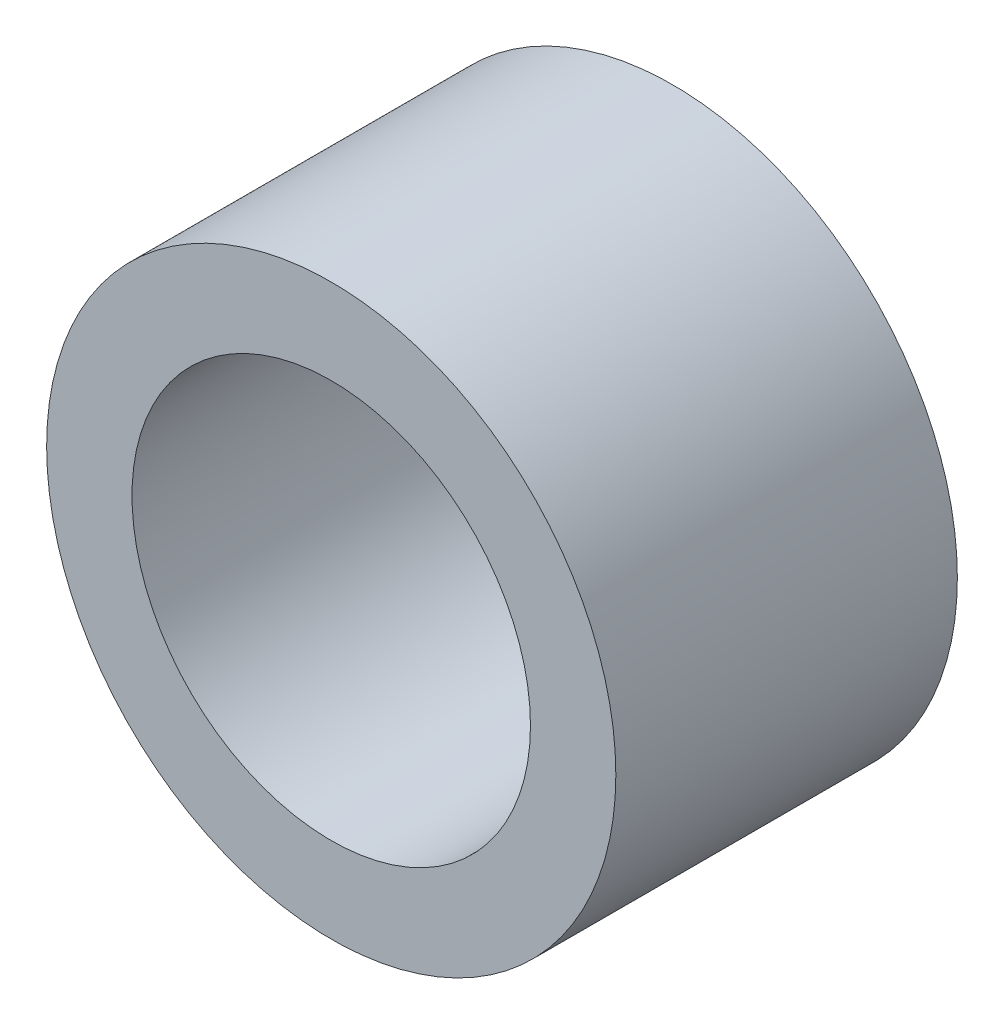
ISO-10303-21;
HEADER;
FILE_DESCRIPTION(('STEP AP214'),'2;1');
FILE_NAME('part.step','',(''),(''),'','','');
FILE_SCHEMA(('AUTOMOTIVE_DESIGN { 1 0 10303 214 1 1 1 1 }'));
ENDSEC;
DATA;
#1=APPLICATION_CONTEXT('core data for automotive mechanical design processes');
#2=APPLICATION_PROTOCOL_DEFINITION('international standard','automotive_design',2000,#1);
#3=PRODUCT_CONTEXT('',#1,'mechanical');
#4=PRODUCT('Part','Part','',(#3));
#5=PRODUCT_RELATED_PRODUCT_CATEGORY('part','',(#4));
#6=PRODUCT_DEFINITION_FORMATION('','',#4);
#7=PRODUCT_DEFINITION_CONTEXT('part definition',#1,'design');
#8=PRODUCT_DEFINITION('design','',#6,#7);
#9=PRODUCT_DEFINITION_SHAPE('','',#8);
#10=(LENGTH_UNIT() NAMED_UNIT(*) SI_UNIT(.MILLI.,.METRE.));
#11=(NAMED_UNIT(*) PLANE_ANGLE_UNIT() SI_UNIT($,.RADIAN.));
#12=(NAMED_UNIT(*) SI_UNIT($,.STERADIAN.) SOLID_ANGLE_UNIT());
#13=UNCERTAINTY_MEASURE_WITH_UNIT(LENGTH_MEASURE(1.E-05),#10,'distance_accuracy_value','');
#14=(GEOMETRIC_REPRESENTATION_CONTEXT(3) GLOBAL_UNCERTAINTY_ASSIGNED_CONTEXT((#13)) GLOBAL_UNIT_ASSIGNED_CONTEXT((#10,
#11,#12)) REPRESENTATION_CONTEXT('',''));
#15=CARTESIAN_POINT('',(0.,0.,0.));
#16=DIRECTION('',(0.,0.,1.));
#17=DIRECTION('',(1.,0.,0.));
#18=AXIS2_PLACEMENT_3D('',#15,#16,#17);
#19=CARTESIAN_POINT('',(-21.4810320238558,16.9738511974218,11.7));
#20=DIRECTION('',(0.,0.,1.));
#21=DIRECTION('',(1.,0.,0.));
#22=AXIS2_PLACEMENT_3D('',#19,#20,#21);
#23=PLANE('',#22);
#24=CARTESIAN_POINT('',(-21.4810320238558,16.9738511974218,11.7));
#25=DIRECTION('',(0.,0.,1.));
#26=DIRECTION('',(1.,0.,0.));
#27=AXIS2_PLACEMENT_3D('',#24,#25,#26);
#28=CIRCLE('',#27,9.5);
#29=CARTESIAN_POINT('',(-11.9810320238558,16.9738511974218,11.7));
#30=VERTEX_POINT('',#29);
#31=EDGE_CURVE('E10',#30,#30,#28,.T.);
#32=ORIENTED_EDGE('',*,*,#31,.T.);
#33=EDGE_LOOP('',(#32));
#34=FACE_BOUND('',#33,.T.);
#35=CARTESIAN_POINT('',(-21.4810320238558,16.9738511974218,11.7));
#36=DIRECTION('',(0.,0.,1.));
#37=DIRECTION('',(1.,0.,0.));
#38=AXIS2_PLACEMENT_3D('',#35,#36,#37);
#39=CIRCLE('',#38,6.65);
#40=CARTESIAN_POINT('',(-14.8310320238558,16.9738511974218,11.7));
#41=VERTEX_POINT('',#40);
#42=EDGE_CURVE('E51',#41,#41,#39,.T.);
#43=ORIENTED_EDGE('',*,*,#42,.F.);
#44=EDGE_LOOP('',(#43));
#45=FACE_BOUND('',#44,.T.);
#46=ADVANCED_FACE('F40',(#34,#45),#23,.T.);
#47=CARTESIAN_POINT('',(-21.4810320238558,16.9738511974218,0.3));
#48=DIRECTION('',(0.,0.,1.));
#49=DIRECTION('',(1.,0.,0.));
#50=AXIS2_PLACEMENT_3D('',#47,#48,#49);
#51=PLANE('',#50);
#52=CARTESIAN_POINT('',(-21.4810320238558,16.9738511974218,0.3));
#53=DIRECTION('',(0.,0.,1.));
#54=DIRECTION('',(1.,0.,0.));
#55=AXIS2_PLACEMENT_3D('',#52,#53,#54);
#56=CIRCLE('',#55,9.5);
#57=CARTESIAN_POINT('',(-11.9810320238558,16.9738511974218,0.3));
#58=VERTEX_POINT('',#57);
#59=EDGE_CURVE('E44',#58,#58,#56,.T.);
#60=ORIENTED_EDGE('',*,*,#59,.F.);
#61=EDGE_LOOP('',(#60));
#62=FACE_BOUND('',#61,.T.);
#63=CARTESIAN_POINT('',(-21.4810320238558,16.9738511974218,0.3));
#64=DIRECTION('',(0.,0.,1.));
#65=DIRECTION('',(1.,0.,0.));
#66=AXIS2_PLACEMENT_3D('',#63,#64,#65);
#67=CIRCLE('',#66,6.65);
#68=CARTESIAN_POINT('',(-14.8310320238558,16.9738511974218,0.3));
#69=VERTEX_POINT('',#68);
#70=EDGE_CURVE('E53',#69,#69,#67,.T.);
#71=ORIENTED_EDGE('',*,*,#70,.T.);
#72=EDGE_LOOP('',(#71));
#73=FACE_BOUND('',#72,.T.);
#74=ADVANCED_FACE('F63',(#62,#73),#51,.F.);
#75=CARTESIAN_POINT('',(-21.4810320238558,16.9738511974218,11.7));
#76=DIRECTION('',(0.,0.,-1.));
#77=DIRECTION('',(-1.,0.,0.));
#78=AXIS2_PLACEMENT_3D('',#75,#76,#77);
#79=CYLINDRICAL_SURFACE('',#78,9.5);
#80=ORIENTED_EDGE('',*,*,#31,.F.);
#81=EDGE_LOOP('',(#80));
#82=FACE_BOUND('',#81,.T.);
#83=ORIENTED_EDGE('',*,*,#59,.T.);
#84=EDGE_LOOP('',(#83));
#85=FACE_BOUND('',#84,.T.);
#86=ADVANCED_FACE('F42',(#82,#85),#79,.T.);
#87=CARTESIAN_POINT('',(-21.4810320238558,16.9738511974218,11.7));
#88=DIRECTION('',(0.,0.,-1.));
#89=DIRECTION('',(-1.,0.,0.));
#90=AXIS2_PLACEMENT_3D('',#87,#88,#89);
#91=CYLINDRICAL_SURFACE('',#90,6.65);
#92=ORIENTED_EDGE('',*,*,#42,.T.);
#93=EDGE_LOOP('',(#92));
#94=FACE_BOUND('',#93,.T.);
#95=ORIENTED_EDGE('',*,*,#70,.F.);
#96=EDGE_LOOP('',(#95));
#97=FACE_BOUND('',#96,.T.);
#98=ADVANCED_FACE('F59',(#94,#97),#91,.F.);
#99=CLOSED_SHELL('',(#46,#74,#86,#98));
#100=MANIFOLD_SOLID_BREP('B2',#99);
#101=ADVANCED_BREP_SHAPE_REPRESENTATION('',(#18,#100),#14);
#102=SHAPE_DEFINITION_REPRESENTATION(#9,#101);
ENDSEC;
END-ISO-10303-21;
